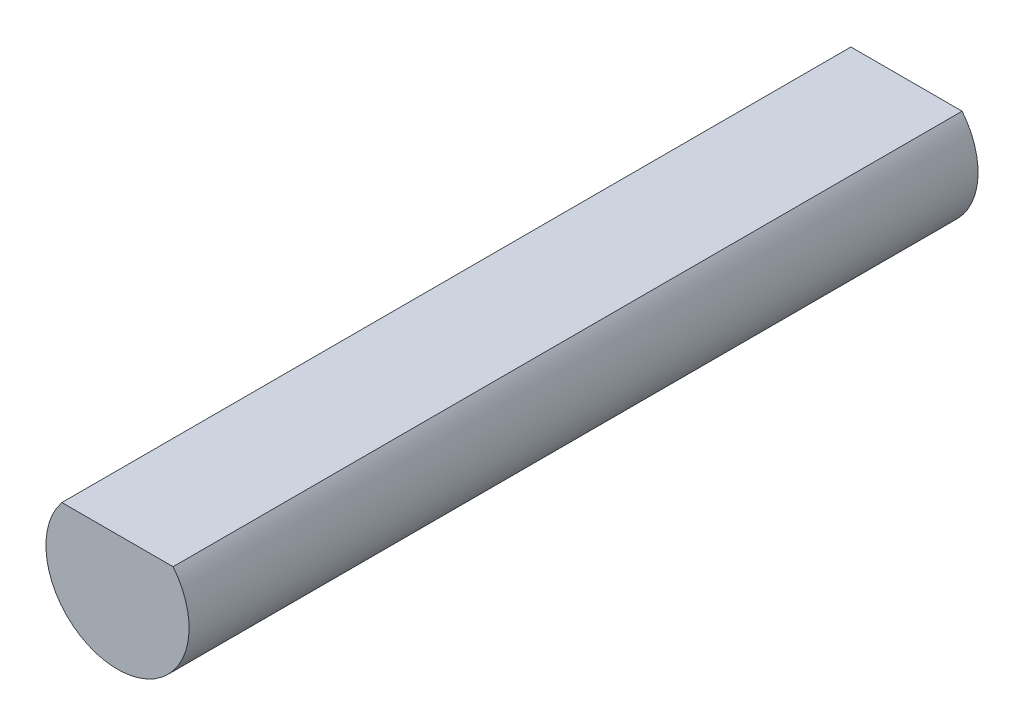
ISO-10303-21;
HEADER;
FILE_DESCRIPTION(('STEP AP214'),'2;1');
FILE_NAME('part.step','',(''),(''),'','','');
FILE_SCHEMA(('AUTOMOTIVE_DESIGN { 1 0 10303 214 1 1 1 1 }'));
ENDSEC;
DATA;
#1=APPLICATION_CONTEXT('core data for automotive mechanical design processes');
#2=APPLICATION_PROTOCOL_DEFINITION('international standard','automotive_design',2000,#1);
#3=PRODUCT_CONTEXT('',#1,'mechanical');
#4=PRODUCT('Part','Part','',(#3));
#5=PRODUCT_RELATED_PRODUCT_CATEGORY('part','',(#4));
#6=PRODUCT_DEFINITION_FORMATION('','',#4);
#7=PRODUCT_DEFINITION_CONTEXT('part definition',#1,'design');
#8=PRODUCT_DEFINITION('design','',#6,#7);
#9=PRODUCT_DEFINITION_SHAPE('','',#8);
#10=(LENGTH_UNIT() NAMED_UNIT(*) SI_UNIT(.MILLI.,.METRE.));
#11=(NAMED_UNIT(*) PLANE_ANGLE_UNIT() SI_UNIT($,.RADIAN.));
#12=(NAMED_UNIT(*) SI_UNIT($,.STERADIAN.) SOLID_ANGLE_UNIT());
#13=UNCERTAINTY_MEASURE_WITH_UNIT(LENGTH_MEASURE(1.E-05),#10,'distance_accuracy_value','');
#14=(GEOMETRIC_REPRESENTATION_CONTEXT(3) GLOBAL_UNCERTAINTY_ASSIGNED_CONTEXT((#13)) GLOBAL_UNIT_ASSIGNED_CONTEXT((#10,
#11,#12)) REPRESENTATION_CONTEXT('',''));
#15=CARTESIAN_POINT('',(0.,0.,0.));
#16=DIRECTION('',(0.,0.,1.));
#17=DIRECTION('',(1.,0.,0.));
#18=AXIS2_PLACEMENT_3D('',#15,#16,#17);
#19=CARTESIAN_POINT('',(0.,0.,35.));
#20=DIRECTION('',(0.,0.,-1.));
#21=DIRECTION('',(-1.,0.,0.));
#22=AXIS2_PLACEMENT_3D('',#19,#20,#21);
#23=CYLINDRICAL_SURFACE('',#22,3.175);
#24=CARTESIAN_POINT('',(0.,0.,0.));
#25=DIRECTION('',(0.,0.,1.));
#26=DIRECTION('',(1.,0.,0.));
#27=AXIS2_PLACEMENT_3D('',#24,#25,#26);
#28=CIRCLE('',#27,3.175);
#29=CARTESIAN_POINT('',(-2.46589233341604,2.,0.));
#30=VERTEX_POINT('',#29);
#31=CARTESIAN_POINT('',(2.46589233341604,2.,0.));
#32=VERTEX_POINT('',#31);
#33=EDGE_CURVE('E72',#30,#32,#28,.T.);
#34=ORIENTED_EDGE('',*,*,#33,.T.);
#35=DIRECTION('',(0.,0.,-1.));
#36=VECTOR('',#35,1.);
#37=CARTESIAN_POINT('',(2.46589233341604,2.,35.));
#38=LINE('',#37,#36);
#39=CARTESIAN_POINT('',(2.46589233341604,2.,35.));
#40=VERTEX_POINT('',#39);
#41=EDGE_CURVE('E11',#40,#32,#38,.T.);
#42=ORIENTED_EDGE('',*,*,#41,.F.);
#43=CARTESIAN_POINT('',(0.,0.,35.));
#44=DIRECTION('',(0.,0.,1.));
#45=DIRECTION('',(1.,0.,0.));
#46=AXIS2_PLACEMENT_3D('',#43,#44,#45);
#47=CIRCLE('',#46,3.175);
#48=CARTESIAN_POINT('',(-2.46589233341604,2.,35.));
#49=VERTEX_POINT('',#48);
#50=EDGE_CURVE('E71',#49,#40,#47,.T.);
#51=ORIENTED_EDGE('',*,*,#50,.F.);
#52=DIRECTION('',(0.,0.,-1.));
#53=VECTOR('',#52,1.);
#54=CARTESIAN_POINT('',(-2.46589233341604,2.,35.));
#55=LINE('',#54,#53);
#56=EDGE_CURVE('E48',#49,#30,#55,.T.);
#57=ORIENTED_EDGE('',*,*,#56,.T.);
#58=EDGE_LOOP('',(#34,#42,#51,#57));
#59=FACE_BOUND('',#58,.T.);
#60=ADVANCED_FACE('F39',(#59),#23,.T.);
#61=CARTESIAN_POINT('',(-2.46589233341604,2.,35.));
#62=DIRECTION('',(0.,-1.,0.));
#63=DIRECTION('',(0.,0.,-1.));
#64=AXIS2_PLACEMENT_3D('',#61,#62,#63);
#65=PLANE('',#64);
#66=DIRECTION('',(-1.,0.,0.));
#67=VECTOR('',#66,1.);
#68=CARTESIAN_POINT('',(-2.46589233341604,2.,0.));
#69=LINE('',#68,#67);
#70=EDGE_CURVE('E63',#32,#30,#69,.T.);
#71=ORIENTED_EDGE('',*,*,#70,.T.);
#72=ORIENTED_EDGE('',*,*,#56,.F.);
#73=DIRECTION('',(-1.,0.,0.));
#74=VECTOR('',#73,1.);
#75=CARTESIAN_POINT('',(-2.46589233341604,2.,35.));
#76=LINE('',#75,#74);
#77=EDGE_CURVE('E55',#40,#49,#76,.T.);
#78=ORIENTED_EDGE('',*,*,#77,.F.);
#79=ORIENTED_EDGE('',*,*,#41,.T.);
#80=EDGE_LOOP('',(#71,#72,#78,#79));
#81=FACE_BOUND('',#80,.T.);
#82=ADVANCED_FACE('F66',(#81),#65,.F.);
#83=CARTESIAN_POINT('',(0.,0.,35.));
#84=DIRECTION('',(0.,0.,1.));
#85=DIRECTION('',(1.,0.,0.));
#86=AXIS2_PLACEMENT_3D('',#83,#84,#85);
#87=PLANE('',#86);
#88=ORIENTED_EDGE('',*,*,#50,.T.);
#89=ORIENTED_EDGE('',*,*,#77,.T.);
#90=EDGE_LOOP('',(#88,#89));
#91=FACE_BOUND('',#90,.T.);
#92=ADVANCED_FACE('F83',(#91),#87,.T.);
#93=CARTESIAN_POINT('',(0.,0.,0.));
#94=DIRECTION('',(0.,0.,1.));
#95=DIRECTION('',(1.,0.,0.));
#96=AXIS2_PLACEMENT_3D('',#93,#94,#95);
#97=PLANE('',#96);
#98=ORIENTED_EDGE('',*,*,#33,.F.);
#99=ORIENTED_EDGE('',*,*,#70,.F.);
#100=EDGE_LOOP('',(#98,#99));
#101=FACE_BOUND('',#100,.T.);
#102=ADVANCED_FACE('F76',(#101),#97,.F.);
#103=CLOSED_SHELL('',(#60,#82,#92,#102));
#104=MANIFOLD_SOLID_BREP('B2',#103);
#105=ADVANCED_BREP_SHAPE_REPRESENTATION('',(#18,#104),#14);
#106=SHAPE_DEFINITION_REPRESENTATION(#9,#105);
ENDSEC;
END-ISO-10303-21;
